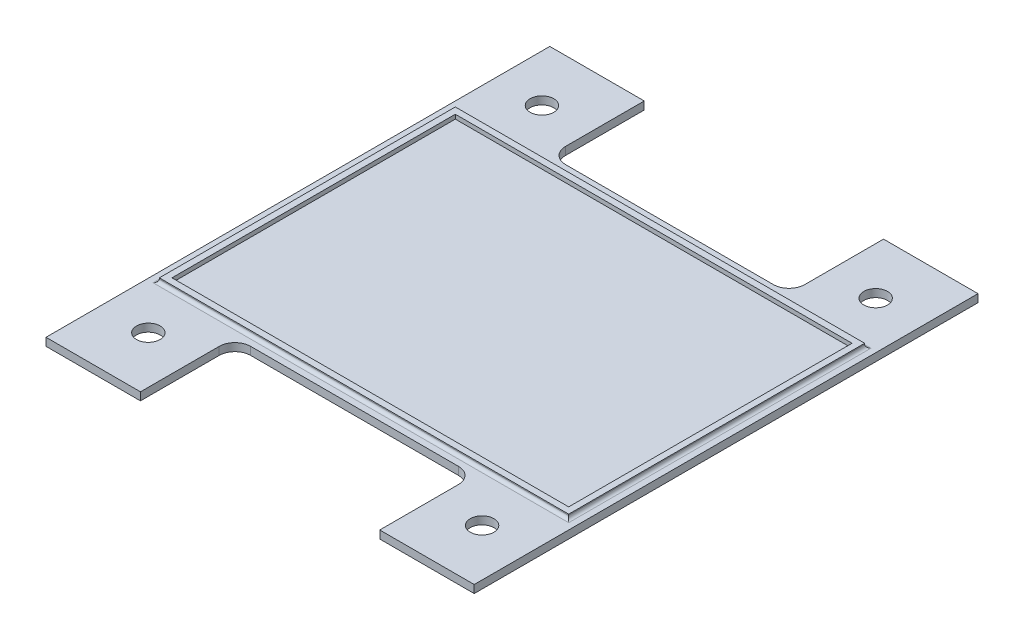
ISO-10303-21;
HEADER;
FILE_DESCRIPTION(('STEP AP214'),'2;1');
FILE_NAME('part.step','',(''),(''),'','','');
FILE_SCHEMA(('AUTOMOTIVE_DESIGN { 1 0 10303 214 1 1 1 1 }'));
ENDSEC;
DATA;
#1=APPLICATION_CONTEXT('core data for automotive mechanical design processes');
#2=APPLICATION_PROTOCOL_DEFINITION('international standard','automotive_design',2000,#1);
#3=PRODUCT_CONTEXT('',#1,'mechanical');
#4=PRODUCT('Part','Part','',(#3));
#5=PRODUCT_RELATED_PRODUCT_CATEGORY('part','',(#4));
#6=PRODUCT_DEFINITION_FORMATION('','',#4);
#7=PRODUCT_DEFINITION_CONTEXT('part definition',#1,'design');
#8=PRODUCT_DEFINITION('design','',#6,#7);
#9=PRODUCT_DEFINITION_SHAPE('','',#8);
#10=(LENGTH_UNIT() NAMED_UNIT(*) SI_UNIT(.MILLI.,.METRE.));
#11=(NAMED_UNIT(*) PLANE_ANGLE_UNIT() SI_UNIT($,.RADIAN.));
#12=(NAMED_UNIT(*) SI_UNIT($,.STERADIAN.) SOLID_ANGLE_UNIT());
#13=UNCERTAINTY_MEASURE_WITH_UNIT(LENGTH_MEASURE(1.E-05),#10,'distance_accuracy_value','');
#14=(GEOMETRIC_REPRESENTATION_CONTEXT(3) GLOBAL_UNCERTAINTY_ASSIGNED_CONTEXT((#13)) GLOBAL_UNIT_ASSIGNED_CONTEXT((#10,
#11,#12)) REPRESENTATION_CONTEXT('',''));
#15=CARTESIAN_POINT('',(0.,0.,0.));
#16=DIRECTION('',(0.,0.,1.));
#17=DIRECTION('',(1.,0.,0.));
#18=AXIS2_PLACEMENT_3D('',#15,#16,#17);
#19=CARTESIAN_POINT('',(0.,3.175,0.));
#20=DIRECTION('',(0.,-1.,0.));
#21=DIRECTION('',(0.,0.,-1.));
#22=AXIS2_PLACEMENT_3D('',#19,#20,#21);
#23=PLANE('',#22);
#24=DIRECTION('',(-1.,0.,0.));
#25=VECTOR('',#24,1.);
#26=CARTESIAN_POINT('',(82.55,3.175,-60.96));
#27=LINE('',#26,#25);
#28=CARTESIAN_POINT('',(-83.82,3.175,-60.96));
#29=VERTEX_POINT('',#28);
#30=CARTESIAN_POINT('',(83.82,3.175,-60.96));
#31=VERTEX_POINT('',#30);
#32=EDGE_CURVE('E390',#29,#31,#27,.F.);
#33=ORIENTED_EDGE('',*,*,#32,.T.);
#34=DIRECTION('',(0.,0.,-1.));
#35=VECTOR('',#34,1.);
#36=CARTESIAN_POINT('',(83.82,3.175,59.69));
#37=LINE('',#36,#35);
#38=CARTESIAN_POINT('',(83.82,3.175,60.96));
#39=VERTEX_POINT('',#38);
#40=EDGE_CURVE('E394',#31,#39,#37,.F.);
#41=ORIENTED_EDGE('',*,*,#40,.T.);
#42=DIRECTION('',(1.,0.,0.));
#43=VECTOR('',#42,1.);
#44=CARTESIAN_POINT('',(-82.55,3.175,60.96));
#45=LINE('',#44,#43);
#46=CARTESIAN_POINT('',(-83.82,3.175,60.96));
#47=VERTEX_POINT('',#46);
#48=EDGE_CURVE('E392',#39,#47,#45,.F.);
#49=ORIENTED_EDGE('',*,*,#48,.T.);
#50=DIRECTION('',(0.,0.,1.));
#51=VECTOR('',#50,1.);
#52=CARTESIAN_POINT('',(-83.82,3.175,-59.69));
#53=LINE('',#52,#51);
#54=EDGE_CURVE('E388',#47,#29,#53,.F.);
#55=ORIENTED_EDGE('',*,*,#54,.T.);
#56=EDGE_LOOP('',(#33,#41,#49,#55));
#57=FACE_BOUND('',#56,.T.);
#58=DIRECTION('',(1.,0.,0.));
#59=VECTOR('',#58,1.);
#60=CARTESIAN_POINT('',(-86.36,3.175,101.6));
#61=LINE('',#60,#59);
#62=CARTESIAN_POINT('',(-86.36,3.175,101.6));
#63=VERTEX_POINT('',#62);
#64=CARTESIAN_POINT('',(-48.26,3.175,101.6));
#65=VERTEX_POINT('',#64);
#66=EDGE_CURVE('E323',#63,#65,#61,.T.);
#67=ORIENTED_EDGE('',*,*,#66,.T.);
#68=DIRECTION('',(0.,0.,1.));
#69=VECTOR('',#68,1.);
#70=CARTESIAN_POINT('',(-48.26,3.175,101.6));
#71=LINE('',#70,#69);
#72=CARTESIAN_POINT('',(-48.26,3.175,69.85));
#73=VERTEX_POINT('',#72);
#74=EDGE_CURVE('E269',#73,#65,#71,.T.);
#75=ORIENTED_EDGE('',*,*,#74,.F.);
#76=CARTESIAN_POINT('',(-41.91,3.175,69.85));
#77=DIRECTION('',(0.,-1.,0.));
#78=DIRECTION('',(0.,0.,-1.));
#79=AXIS2_PLACEMENT_3D('',#76,#77,#78);
#80=CIRCLE('',#79,6.35);
#81=CARTESIAN_POINT('',(-41.91,3.175,63.5));
#82=VERTEX_POINT('',#81);
#83=EDGE_CURVE('E381',#73,#82,#80,.T.);
#84=ORIENTED_EDGE('',*,*,#83,.T.);
#85=DIRECTION('',(-1.,0.,0.));
#86=VECTOR('',#85,1.);
#87=CARTESIAN_POINT('',(-48.26,3.175,63.5));
#88=LINE('',#87,#86);
#89=CARTESIAN_POINT('',(41.91,3.175,63.5));
#90=VERTEX_POINT('',#89);
#91=EDGE_CURVE('E273',#90,#82,#88,.T.);
#92=ORIENTED_EDGE('',*,*,#91,.F.);
#93=CARTESIAN_POINT('',(41.91,3.175,69.85));
#94=DIRECTION('',(0.,-1.,0.));
#95=DIRECTION('',(0.,0.,-1.));
#96=AXIS2_PLACEMENT_3D('',#93,#94,#95);
#97=CIRCLE('',#96,6.35);
#98=CARTESIAN_POINT('',(48.26,3.175,69.85));
#99=VERTEX_POINT('',#98);
#100=EDGE_CURVE('E377',#90,#99,#97,.T.);
#101=ORIENTED_EDGE('',*,*,#100,.T.);
#102=DIRECTION('',(0.,0.,-1.));
#103=VECTOR('',#102,1.);
#104=CARTESIAN_POINT('',(48.26,3.175,101.6));
#105=LINE('',#104,#103);
#106=CARTESIAN_POINT('',(48.26,3.175,101.6));
#107=VERTEX_POINT('',#106);
#108=EDGE_CURVE('E281',#107,#99,#105,.T.);
#109=ORIENTED_EDGE('',*,*,#108,.F.);
#110=CARTESIAN_POINT('',(86.36,3.175,101.6));
#111=VERTEX_POINT('',#110);
#112=EDGE_CURVE('E322',#107,#111,#61,.T.);
#113=ORIENTED_EDGE('',*,*,#112,.T.);
#114=DIRECTION('',(0.,0.,-1.));
#115=VECTOR('',#114,1.);
#116=CARTESIAN_POINT('',(86.36,3.175,101.6));
#117=LINE('',#116,#115);
#118=CARTESIAN_POINT('',(86.36,3.175,-101.6));
#119=VERTEX_POINT('',#118);
#120=EDGE_CURVE('E312',#111,#119,#117,.T.);
#121=ORIENTED_EDGE('',*,*,#120,.T.);
#122=DIRECTION('',(-1.,0.,0.));
#123=VECTOR('',#122,1.);
#124=CARTESIAN_POINT('',(-86.36,3.175,-101.6));
#125=LINE('',#124,#123);
#126=CARTESIAN_POINT('',(48.26,3.175,-101.6));
#127=VERTEX_POINT('',#126);
#128=EDGE_CURVE('E317',#119,#127,#125,.T.);
#129=ORIENTED_EDGE('',*,*,#128,.T.);
#130=DIRECTION('',(0.,0.,-1.));
#131=VECTOR('',#130,1.);
#132=CARTESIAN_POINT('',(48.26,3.175,-101.6));
#133=LINE('',#132,#131);
#134=CARTESIAN_POINT('',(48.26,3.175,-69.85));
#135=VERTEX_POINT('',#134);
#136=EDGE_CURVE('E295',#135,#127,#133,.T.);
#137=ORIENTED_EDGE('',*,*,#136,.F.);
#138=CARTESIAN_POINT('',(41.91,3.175,-69.85));
#139=DIRECTION('',(0.,-1.,0.));
#140=DIRECTION('',(0.,0.,-1.));
#141=AXIS2_PLACEMENT_3D('',#138,#139,#140);
#142=CIRCLE('',#141,6.35);
#143=CARTESIAN_POINT('',(41.91,3.175,-63.5));
#144=VERTEX_POINT('',#143);
#145=EDGE_CURVE('E373',#135,#144,#142,.T.);
#146=ORIENTED_EDGE('',*,*,#145,.T.);
#147=DIRECTION('',(1.,0.,0.));
#148=VECTOR('',#147,1.);
#149=CARTESIAN_POINT('',(-48.26,3.175,-63.5));
#150=LINE('',#149,#148);
#151=CARTESIAN_POINT('',(-41.91,3.175,-63.5));
#152=VERTEX_POINT('',#151);
#153=EDGE_CURVE('E303',#152,#144,#150,.T.);
#154=ORIENTED_EDGE('',*,*,#153,.F.);
#155=CARTESIAN_POINT('',(-41.91,3.175,-69.85));
#156=DIRECTION('',(0.,-1.,0.));
#157=DIRECTION('',(0.,0.,-1.));
#158=AXIS2_PLACEMENT_3D('',#155,#156,#157);
#159=CIRCLE('',#158,6.35);
#160=CARTESIAN_POINT('',(-48.26,3.175,-69.85));
#161=VERTEX_POINT('',#160);
#162=EDGE_CURVE('E369',#152,#161,#159,.T.);
#163=ORIENTED_EDGE('',*,*,#162,.T.);
#164=DIRECTION('',(0.,0.,1.));
#165=VECTOR('',#164,1.);
#166=CARTESIAN_POINT('',(-48.26,3.175,-101.6));
#167=LINE('',#166,#165);
#168=CARTESIAN_POINT('',(-48.26,3.175,-101.6));
#169=VERTEX_POINT('',#168);
#170=EDGE_CURVE('E288',#169,#161,#167,.T.);
#171=ORIENTED_EDGE('',*,*,#170,.F.);
#172=CARTESIAN_POINT('',(-86.36,3.175,-101.6));
#173=VERTEX_POINT('',#172);
#174=EDGE_CURVE('E315',#169,#173,#125,.T.);
#175=ORIENTED_EDGE('',*,*,#174,.T.);
#176=DIRECTION('',(0.,0.,1.));
#177=VECTOR('',#176,1.);
#178=CARTESIAN_POINT('',(-86.36,3.175,101.6));
#179=LINE('',#178,#177);
#180=EDGE_CURVE('E320',#173,#63,#179,.T.);
#181=ORIENTED_EDGE('',*,*,#180,.T.);
#182=EDGE_LOOP('',(#67,#75,#84,#92,#101,#109,#113,#121,#129,#137,#146,#154,#163,#171,#175,#181));
#183=FACE_BOUND('',#182,.T.);
#184=CARTESIAN_POINT('',(-67.31,3.175,79.375));
#185=DIRECTION('',(0.,1.,0.));
#186=DIRECTION('',(0.,0.,1.));
#187=AXIS2_PLACEMENT_3D('',#184,#185,#186);
#188=CIRCLE('',#187,4.76249999999999);
#189=CARTESIAN_POINT('',(-67.31,3.175,84.1375));
#190=VERTEX_POINT('',#189);
#191=EDGE_CURVE('E810',#190,#190,#188,.T.);
#192=ORIENTED_EDGE('',*,*,#191,.F.);
#193=EDGE_LOOP('',(#192));
#194=FACE_BOUND('',#193,.T.);
#195=CARTESIAN_POINT('',(-67.31,3.175,-79.375));
#196=DIRECTION('',(0.,1.,0.));
#197=DIRECTION('',(0.,0.,1.));
#198=AXIS2_PLACEMENT_3D('',#195,#196,#197);
#199=CIRCLE('',#198,4.76249999999999);
#200=CARTESIAN_POINT('',(-67.31,3.175,-74.6125));
#201=VERTEX_POINT('',#200);
#202=EDGE_CURVE('E814',#201,#201,#199,.T.);
#203=ORIENTED_EDGE('',*,*,#202,.F.);
#204=EDGE_LOOP('',(#203));
#205=FACE_BOUND('',#204,.T.);
#206=CARTESIAN_POINT('',(67.31,3.175,-79.375));
#207=DIRECTION('',(0.,1.,0.));
#208=DIRECTION('',(0.,0.,1.));
#209=AXIS2_PLACEMENT_3D('',#206,#207,#208);
#210=CIRCLE('',#209,4.76249999999999);
#211=CARTESIAN_POINT('',(67.31,3.175,-74.6125));
#212=VERTEX_POINT('',#211);
#213=EDGE_CURVE('E818',#212,#212,#210,.T.);
#214=ORIENTED_EDGE('',*,*,#213,.F.);
#215=EDGE_LOOP('',(#214));
#216=FACE_BOUND('',#215,.T.);
#217=CARTESIAN_POINT('',(67.31,3.175,79.375));
#218=DIRECTION('',(0.,1.,0.));
#219=DIRECTION('',(0.,0.,1.));
#220=AXIS2_PLACEMENT_3D('',#217,#218,#219);
#221=CIRCLE('',#220,4.76249999999999);
#222=CARTESIAN_POINT('',(67.31,3.175,84.1375));
#223=VERTEX_POINT('',#222);
#224=EDGE_CURVE('E821',#223,#223,#221,.T.);
#225=ORIENTED_EDGE('',*,*,#224,.F.);
#226=EDGE_LOOP('',(#225));
#227=FACE_BOUND('',#226,.T.);
#228=ADVANCED_FACE('F33',(#57,#183,#194,#205,#216,#227),#23,.F.);
#229=CARTESIAN_POINT('',(-86.36,3.175,101.6));
#230=DIRECTION('',(0.,0.,-1.));
#231=DIRECTION('',(-1.,0.,0.));
#232=AXIS2_PLACEMENT_3D('',#229,#230,#231);
#233=PLANE('',#232);
#234=DIRECTION('',(1.,0.,0.));
#235=VECTOR('',#234,1.);
#236=CARTESIAN_POINT('',(-86.36,0.,101.6));
#237=LINE('',#236,#235);
#238=CARTESIAN_POINT('',(-86.36,0.,101.6));
#239=VERTEX_POINT('',#238);
#240=CARTESIAN_POINT('',(-48.26,0.,101.6));
#241=VERTEX_POINT('',#240);
#242=EDGE_CURVE('E316',#239,#241,#237,.T.);
#243=ORIENTED_EDGE('',*,*,#242,.T.);
#244=DIRECTION('',(0.,1.,0.));
#245=VECTOR('',#244,1.);
#246=CARTESIAN_POINT('',(-48.26,0.,101.6));
#247=LINE('',#246,#245);
#248=EDGE_CURVE('E279',#241,#65,#247,.T.);
#249=ORIENTED_EDGE('',*,*,#248,.T.);
#250=ORIENTED_EDGE('',*,*,#66,.F.);
#251=DIRECTION('',(0.,-1.,0.));
#252=VECTOR('',#251,1.);
#253=CARTESIAN_POINT('',(-86.36,3.175,101.6));
#254=LINE('',#253,#252);
#255=EDGE_CURVE('E340',#63,#239,#254,.T.);
#256=ORIENTED_EDGE('',*,*,#255,.T.);
#257=EDGE_LOOP('',(#243,#249,#250,#256));
#258=FACE_BOUND('',#257,.T.);
#259=ADVANCED_FACE('F447',(#258),#233,.F.);
#260=CARTESIAN_POINT('',(-86.36,3.175,-101.6));
#261=DIRECTION('',(0.,0.,1.));
#262=DIRECTION('',(1.,0.,0.));
#263=AXIS2_PLACEMENT_3D('',#260,#261,#262);
#264=PLANE('',#263);
#265=ORIENTED_EDGE('',*,*,#174,.F.);
#266=DIRECTION('',(0.,1.,0.));
#267=VECTOR('',#266,1.);
#268=CARTESIAN_POINT('',(-48.26,0.,-101.6));
#269=LINE('',#268,#267);
#270=CARTESIAN_POINT('',(-48.26,0.,-101.6));
#271=VERTEX_POINT('',#270);
#272=EDGE_CURVE('E307',#271,#169,#269,.T.);
#273=ORIENTED_EDGE('',*,*,#272,.F.);
#274=DIRECTION('',(-1.,0.,0.));
#275=VECTOR('',#274,1.);
#276=CARTESIAN_POINT('',(-86.36,0.,-101.6));
#277=LINE('',#276,#275);
#278=CARTESIAN_POINT('',(-86.36,0.,-101.6));
#279=VERTEX_POINT('',#278);
#280=EDGE_CURVE('E329',#271,#279,#277,.T.);
#281=ORIENTED_EDGE('',*,*,#280,.T.);
#282=DIRECTION('',(0.,-1.,0.));
#283=VECTOR('',#282,1.);
#284=CARTESIAN_POINT('',(-86.36,3.175,-101.6));
#285=LINE('',#284,#283);
#286=EDGE_CURVE('E343',#173,#279,#285,.T.);
#287=ORIENTED_EDGE('',*,*,#286,.F.);
#288=EDGE_LOOP('',(#265,#273,#281,#287));
#289=FACE_BOUND('',#288,.T.);
#290=ADVANCED_FACE('F453',(#289),#264,.F.);
#291=CARTESIAN_POINT('',(86.36,3.175,101.6));
#292=DIRECTION('',(-1.,0.,0.));
#293=DIRECTION('',(0.,0.,1.));
#294=AXIS2_PLACEMENT_3D('',#291,#292,#293);
#295=PLANE('',#294);
#296=DIRECTION('',(0.,0.,-1.));
#297=VECTOR('',#296,1.);
#298=CARTESIAN_POINT('',(86.36,0.,101.6));
#299=LINE('',#298,#297);
#300=CARTESIAN_POINT('',(86.36,0.,101.6));
#301=VERTEX_POINT('',#300);
#302=CARTESIAN_POINT('',(86.36,0.,-101.6));
#303=VERTEX_POINT('',#302);
#304=EDGE_CURVE('E309',#301,#303,#299,.T.);
#305=ORIENTED_EDGE('',*,*,#304,.T.);
#306=DIRECTION('',(0.,-1.,0.));
#307=VECTOR('',#306,1.);
#308=CARTESIAN_POINT('',(86.36,3.175,-101.6));
#309=LINE('',#308,#307);
#310=EDGE_CURVE('E346',#119,#303,#309,.T.);
#311=ORIENTED_EDGE('',*,*,#310,.F.);
#312=ORIENTED_EDGE('',*,*,#120,.F.);
#313=DIRECTION('',(0.,-1.,0.));
#314=VECTOR('',#313,1.);
#315=CARTESIAN_POINT('',(86.36,3.175,101.6));
#316=LINE('',#315,#314);
#317=EDGE_CURVE('E326',#111,#301,#316,.T.);
#318=ORIENTED_EDGE('',*,*,#317,.T.);
#319=EDGE_LOOP('',(#305,#311,#312,#318));
#320=FACE_BOUND('',#319,.T.);
#321=ADVANCED_FACE('F707',(#320),#295,.F.);
#322=CARTESIAN_POINT('',(48.26,0.,-101.6));
#323=VERTEX_POINT('',#322);
#324=EDGE_CURVE('E330',#303,#323,#277,.T.);
#325=ORIENTED_EDGE('',*,*,#324,.T.);
#326=DIRECTION('',(0.,1.,0.));
#327=VECTOR('',#326,1.);
#328=CARTESIAN_POINT('',(48.26,0.,-101.6));
#329=LINE('',#328,#327);
#330=EDGE_CURVE('E300',#323,#127,#329,.T.);
#331=ORIENTED_EDGE('',*,*,#330,.T.);
#332=ORIENTED_EDGE('',*,*,#128,.F.);
#333=ORIENTED_EDGE('',*,*,#310,.T.);
#334=EDGE_LOOP('',(#325,#331,#332,#333));
#335=FACE_BOUND('',#334,.T.);
#336=ADVANCED_FACE('F710',(#335),#264,.F.);
#337=CARTESIAN_POINT('',(-86.36,3.175,101.6));
#338=DIRECTION('',(1.,0.,0.));
#339=DIRECTION('',(0.,0.,-1.));
#340=AXIS2_PLACEMENT_3D('',#337,#338,#339);
#341=PLANE('',#340);
#342=DIRECTION('',(0.,0.,1.));
#343=VECTOR('',#342,1.);
#344=CARTESIAN_POINT('',(-86.36,0.,101.6));
#345=LINE('',#344,#343);
#346=EDGE_CURVE('E333',#279,#239,#345,.T.);
#347=ORIENTED_EDGE('',*,*,#346,.T.);
#348=ORIENTED_EDGE('',*,*,#255,.F.);
#349=ORIENTED_EDGE('',*,*,#180,.F.);
#350=ORIENTED_EDGE('',*,*,#286,.T.);
#351=EDGE_LOOP('',(#347,#348,#349,#350));
#352=FACE_BOUND('',#351,.T.);
#353=ADVANCED_FACE('F727',(#352),#341,.F.);
#354=ORIENTED_EDGE('',*,*,#112,.F.);
#355=DIRECTION('',(0.,1.,0.));
#356=VECTOR('',#355,1.);
#357=CARTESIAN_POINT('',(48.26,0.,101.6));
#358=LINE('',#357,#356);
#359=CARTESIAN_POINT('',(48.26,0.,101.6));
#360=VERTEX_POINT('',#359);
#361=EDGE_CURVE('E286',#360,#107,#358,.T.);
#362=ORIENTED_EDGE('',*,*,#361,.F.);
#363=EDGE_CURVE('E335',#360,#301,#237,.T.);
#364=ORIENTED_EDGE('',*,*,#363,.T.);
#365=ORIENTED_EDGE('',*,*,#317,.F.);
#366=EDGE_LOOP('',(#354,#362,#364,#365));
#367=FACE_BOUND('',#366,.T.);
#368=ADVANCED_FACE('F456',(#367),#233,.F.);
#369=CARTESIAN_POINT('',(0.,0.,0.));
#370=DIRECTION('',(0.,-1.,0.));
#371=DIRECTION('',(0.,0.,-1.));
#372=AXIS2_PLACEMENT_3D('',#369,#370,#371);
#373=PLANE('',#372);
#374=CARTESIAN_POINT('',(67.31,0.,79.375));
#375=DIRECTION('',(0.,-1.,0.));
#376=DIRECTION('',(0.,0.,-1.));
#377=AXIS2_PLACEMENT_3D('',#374,#375,#376);
#378=CIRCLE('',#377,4.7625);
#379=CARTESIAN_POINT('',(67.31,0.,74.6125));
#380=VERTEX_POINT('',#379);
#381=EDGE_CURVE('E822',#380,#380,#378,.T.);
#382=ORIENTED_EDGE('',*,*,#381,.F.);
#383=EDGE_LOOP('',(#382));
#384=FACE_BOUND('',#383,.T.);
#385=CARTESIAN_POINT('',(67.31,0.,-79.375));
#386=DIRECTION('',(0.,-1.,0.));
#387=DIRECTION('',(0.,0.,-1.));
#388=AXIS2_PLACEMENT_3D('',#385,#386,#387);
#389=CIRCLE('',#388,4.7625);
#390=CARTESIAN_POINT('',(67.31,0.,-84.1375));
#391=VERTEX_POINT('',#390);
#392=EDGE_CURVE('E828',#391,#391,#389,.T.);
#393=ORIENTED_EDGE('',*,*,#392,.F.);
#394=EDGE_LOOP('',(#393));
#395=FACE_BOUND('',#394,.T.);
#396=CARTESIAN_POINT('',(-67.31,0.,-79.375));
#397=DIRECTION('',(0.,-1.,0.));
#398=DIRECTION('',(0.,0.,-1.));
#399=AXIS2_PLACEMENT_3D('',#396,#397,#398);
#400=CIRCLE('',#399,4.7625);
#401=CARTESIAN_POINT('',(-67.31,0.,-84.1375));
#402=VERTEX_POINT('',#401);
#403=EDGE_CURVE('E832',#402,#402,#400,.T.);
#404=ORIENTED_EDGE('',*,*,#403,.F.);
#405=EDGE_LOOP('',(#404));
#406=FACE_BOUND('',#405,.T.);
#407=CARTESIAN_POINT('',(-67.31,0.,79.375));
#408=DIRECTION('',(0.,-1.,0.));
#409=DIRECTION('',(0.,0.,-1.));
#410=AXIS2_PLACEMENT_3D('',#407,#408,#409);
#411=CIRCLE('',#410,4.7625);
#412=CARTESIAN_POINT('',(-67.31,0.,74.6125));
#413=VERTEX_POINT('',#412);
#414=EDGE_CURVE('E403',#413,#413,#411,.T.);
#415=ORIENTED_EDGE('',*,*,#414,.F.);
#416=EDGE_LOOP('',(#415));
#417=FACE_BOUND('',#416,.T.);
#418=DIRECTION('',(-1.,0.,0.));
#419=VECTOR('',#418,1.);
#420=CARTESIAN_POINT('',(-48.26,0.,63.5));
#421=LINE('',#420,#419);
#422=CARTESIAN_POINT('',(41.91,0.,63.5));
#423=VERTEX_POINT('',#422);
#424=CARTESIAN_POINT('',(-41.91,0.,63.5));
#425=VERTEX_POINT('',#424);
#426=EDGE_CURVE('E276',#423,#425,#421,.T.);
#427=ORIENTED_EDGE('',*,*,#426,.T.);
#428=CARTESIAN_POINT('',(-41.91,0.,69.85));
#429=DIRECTION('',(0.,-1.,0.));
#430=DIRECTION('',(0.,0.,-1.));
#431=AXIS2_PLACEMENT_3D('',#428,#429,#430);
#432=CIRCLE('',#431,6.35);
#433=CARTESIAN_POINT('',(-48.26,0.,69.85));
#434=VERTEX_POINT('',#433);
#435=EDGE_CURVE('E383',#425,#434,#432,.F.);
#436=ORIENTED_EDGE('',*,*,#435,.T.);
#437=DIRECTION('',(0.,0.,1.));
#438=VECTOR('',#437,1.);
#439=CARTESIAN_POINT('',(-48.26,0.,101.6));
#440=LINE('',#439,#438);
#441=EDGE_CURVE('E270',#434,#241,#440,.T.);
#442=ORIENTED_EDGE('',*,*,#441,.T.);
#443=ORIENTED_EDGE('',*,*,#242,.F.);
#444=ORIENTED_EDGE('',*,*,#346,.F.);
#445=ORIENTED_EDGE('',*,*,#280,.F.);
#446=DIRECTION('',(0.,0.,1.));
#447=VECTOR('',#446,1.);
#448=CARTESIAN_POINT('',(-48.26,0.,-101.6));
#449=LINE('',#448,#447);
#450=CARTESIAN_POINT('',(-48.26,0.,-69.85));
#451=VERTEX_POINT('',#450);
#452=EDGE_CURVE('E291',#271,#451,#449,.T.);
#453=ORIENTED_EDGE('',*,*,#452,.T.);
#454=CARTESIAN_POINT('',(-41.91,0.,-69.85));
#455=DIRECTION('',(0.,-1.,0.));
#456=DIRECTION('',(0.,0.,-1.));
#457=AXIS2_PLACEMENT_3D('',#454,#455,#456);
#458=CIRCLE('',#457,6.35);
#459=CARTESIAN_POINT('',(-41.91,0.,-63.5));
#460=VERTEX_POINT('',#459);
#461=EDGE_CURVE('E371',#451,#460,#458,.F.);
#462=ORIENTED_EDGE('',*,*,#461,.T.);
#463=DIRECTION('',(1.,0.,0.));
#464=VECTOR('',#463,1.);
#465=CARTESIAN_POINT('',(-48.26,0.,-63.5));
#466=LINE('',#465,#464);
#467=CARTESIAN_POINT('',(41.91,0.,-63.5));
#468=VERTEX_POINT('',#467);
#469=EDGE_CURVE('E294',#460,#468,#466,.T.);
#470=ORIENTED_EDGE('',*,*,#469,.T.);
#471=CARTESIAN_POINT('',(41.91,0.,-69.85));
#472=DIRECTION('',(0.,-1.,0.));
#473=DIRECTION('',(0.,0.,-1.));
#474=AXIS2_PLACEMENT_3D('',#471,#472,#473);
#475=CIRCLE('',#474,6.35);
#476=CARTESIAN_POINT('',(48.26,0.,-69.85));
#477=VERTEX_POINT('',#476);
#478=EDGE_CURVE('E375',#468,#477,#475,.F.);
#479=ORIENTED_EDGE('',*,*,#478,.T.);
#480=DIRECTION('',(0.,0.,-1.));
#481=VECTOR('',#480,1.);
#482=CARTESIAN_POINT('',(48.26,0.,-101.6));
#483=LINE('',#482,#481);
#484=EDGE_CURVE('E298',#477,#323,#483,.T.);
#485=ORIENTED_EDGE('',*,*,#484,.T.);
#486=ORIENTED_EDGE('',*,*,#324,.F.);
#487=ORIENTED_EDGE('',*,*,#304,.F.);
#488=ORIENTED_EDGE('',*,*,#363,.F.);
#489=DIRECTION('',(0.,0.,-1.));
#490=VECTOR('',#489,1.);
#491=CARTESIAN_POINT('',(48.26,0.,101.6));
#492=LINE('',#491,#490);
#493=CARTESIAN_POINT('',(48.26,0.,69.85));
#494=VERTEX_POINT('',#493);
#495=EDGE_CURVE('E272',#360,#494,#492,.T.);
#496=ORIENTED_EDGE('',*,*,#495,.T.);
#497=CARTESIAN_POINT('',(41.91,0.,69.85));
#498=DIRECTION('',(0.,-1.,0.));
#499=DIRECTION('',(0.,0.,-1.));
#500=AXIS2_PLACEMENT_3D('',#497,#498,#499);
#501=CIRCLE('',#500,6.35);
#502=EDGE_CURVE('E379',#494,#423,#501,.F.);
#503=ORIENTED_EDGE('',*,*,#502,.T.);
#504=EDGE_LOOP('',(#427,#436,#442,#443,#444,#445,#453,#462,#470,#479,#485,#486,#487,#488,#496,#503));
#505=FACE_BOUND('',#504,.T.);
#506=ADVANCED_FACE('F692',(#384,#395,#406,#417,#505),#373,.T.);
#507=CARTESIAN_POINT('',(-48.26,0.,-101.6));
#508=DIRECTION('',(-1.,0.,0.));
#509=DIRECTION('',(0.,0.,1.));
#510=AXIS2_PLACEMENT_3D('',#507,#508,#509);
#511=PLANE('',#510);
#512=ORIENTED_EDGE('',*,*,#170,.T.);
#513=DIRECTION('',(0.,1.,0.));
#514=VECTOR('',#513,1.);
#515=CARTESIAN_POINT('',(-48.26,0.,-69.85));
#516=LINE('',#515,#514);
#517=EDGE_CURVE('E354',#161,#451,#516,.F.);
#518=ORIENTED_EDGE('',*,*,#517,.T.);
#519=ORIENTED_EDGE('',*,*,#452,.F.);
#520=ORIENTED_EDGE('',*,*,#272,.T.);
#521=EDGE_LOOP('',(#512,#518,#519,#520));
#522=FACE_BOUND('',#521,.T.);
#523=ADVANCED_FACE('F683',(#522),#511,.F.);
#524=CARTESIAN_POINT('',(48.26,0.,-101.6));
#525=DIRECTION('',(1.,0.,0.));
#526=DIRECTION('',(0.,0.,-1.));
#527=AXIS2_PLACEMENT_3D('',#524,#525,#526);
#528=PLANE('',#527);
#529=ORIENTED_EDGE('',*,*,#484,.F.);
#530=DIRECTION('',(0.,1.,0.));
#531=VECTOR('',#530,1.);
#532=CARTESIAN_POINT('',(48.26,3.175,-69.85));
#533=LINE('',#532,#531);
#534=EDGE_CURVE('E356',#477,#135,#533,.T.);
#535=ORIENTED_EDGE('',*,*,#534,.T.);
#536=ORIENTED_EDGE('',*,*,#136,.T.);
#537=ORIENTED_EDGE('',*,*,#330,.F.);
#538=EDGE_LOOP('',(#529,#535,#536,#537));
#539=FACE_BOUND('',#538,.T.);
#540=ADVANCED_FACE('F674',(#539),#528,.F.);
#541=CARTESIAN_POINT('',(-48.26,0.,-63.5));
#542=DIRECTION('',(0.,0.,1.));
#543=DIRECTION('',(1.,0.,0.));
#544=AXIS2_PLACEMENT_3D('',#541,#542,#543);
#545=PLANE('',#544);
#546=ORIENTED_EDGE('',*,*,#469,.F.);
#547=DIRECTION('',(0.,1.,0.));
#548=VECTOR('',#547,1.);
#549=CARTESIAN_POINT('',(-41.91,3.175,-63.5));
#550=LINE('',#549,#548);
#551=EDGE_CURVE('E351',#460,#152,#550,.T.);
#552=ORIENTED_EDGE('',*,*,#551,.T.);
#553=ORIENTED_EDGE('',*,*,#153,.T.);
#554=DIRECTION('',(0.,1.,0.));
#555=VECTOR('',#554,1.);
#556=CARTESIAN_POINT('',(41.91,0.,-63.5));
#557=LINE('',#556,#555);
#558=EDGE_CURVE('E349',#144,#468,#557,.F.);
#559=ORIENTED_EDGE('',*,*,#558,.T.);
#560=EDGE_LOOP('',(#546,#552,#553,#559));
#561=FACE_BOUND('',#560,.T.);
#562=ADVANCED_FACE('F665',(#561),#545,.F.);
#563=CARTESIAN_POINT('',(-48.26,0.,101.6));
#564=DIRECTION('',(-1.,0.,0.));
#565=DIRECTION('',(0.,0.,1.));
#566=AXIS2_PLACEMENT_3D('',#563,#564,#565);
#567=PLANE('',#566);
#568=ORIENTED_EDGE('',*,*,#441,.F.);
#569=DIRECTION('',(0.,1.,0.));
#570=VECTOR('',#569,1.);
#571=CARTESIAN_POINT('',(-48.26,3.175,69.85));
#572=LINE('',#571,#570);
#573=EDGE_CURVE('E366',#434,#73,#572,.T.);
#574=ORIENTED_EDGE('',*,*,#573,.T.);
#575=ORIENTED_EDGE('',*,*,#74,.T.);
#576=ORIENTED_EDGE('',*,*,#248,.F.);
#577=EDGE_LOOP('',(#568,#574,#575,#576));
#578=FACE_BOUND('',#577,.T.);
#579=ADVANCED_FACE('F656',(#578),#567,.F.);
#580=CARTESIAN_POINT('',(-48.26,0.,63.5));
#581=DIRECTION('',(0.,0.,-1.));
#582=DIRECTION('',(-1.,0.,0.));
#583=AXIS2_PLACEMENT_3D('',#580,#581,#582);
#584=PLANE('',#583);
#585=ORIENTED_EDGE('',*,*,#426,.F.);
#586=DIRECTION('',(0.,1.,0.));
#587=VECTOR('',#586,1.);
#588=CARTESIAN_POINT('',(41.91,3.175,63.5));
#589=LINE('',#588,#587);
#590=EDGE_CURVE('E361',#423,#90,#589,.T.);
#591=ORIENTED_EDGE('',*,*,#590,.T.);
#592=ORIENTED_EDGE('',*,*,#91,.T.);
#593=DIRECTION('',(0.,1.,0.));
#594=VECTOR('',#593,1.);
#595=CARTESIAN_POINT('',(-41.91,0.,63.5));
#596=LINE('',#595,#594);
#597=EDGE_CURVE('E359',#82,#425,#596,.F.);
#598=ORIENTED_EDGE('',*,*,#597,.T.);
#599=EDGE_LOOP('',(#585,#591,#592,#598));
#600=FACE_BOUND('',#599,.T.);
#601=ADVANCED_FACE('F647',(#600),#584,.F.);
#602=CARTESIAN_POINT('',(48.26,0.,101.6));
#603=DIRECTION('',(1.,0.,0.));
#604=DIRECTION('',(0.,0.,-1.));
#605=AXIS2_PLACEMENT_3D('',#602,#603,#604);
#606=PLANE('',#605);
#607=ORIENTED_EDGE('',*,*,#108,.T.);
#608=DIRECTION('',(0.,1.,0.));
#609=VECTOR('',#608,1.);
#610=CARTESIAN_POINT('',(48.26,0.,69.85));
#611=LINE('',#610,#609);
#612=EDGE_CURVE('E364',#99,#494,#611,.F.);
#613=ORIENTED_EDGE('',*,*,#612,.T.);
#614=ORIENTED_EDGE('',*,*,#495,.F.);
#615=ORIENTED_EDGE('',*,*,#361,.T.);
#616=EDGE_LOOP('',(#607,#613,#614,#615));
#617=FACE_BOUND('',#616,.T.);
#618=ADVANCED_FACE('F638',(#617),#606,.F.);
#619=CARTESIAN_POINT('',(-41.91,0.,-69.85));
#620=DIRECTION('',(0.,-1.,0.));
#621=DIRECTION('',(0.,0.,-1.));
#622=AXIS2_PLACEMENT_3D('',#619,#620,#621);
#623=CYLINDRICAL_SURFACE('',#622,6.35);
#624=ORIENTED_EDGE('',*,*,#461,.F.);
#625=ORIENTED_EDGE('',*,*,#517,.F.);
#626=ORIENTED_EDGE('',*,*,#162,.F.);
#627=ORIENTED_EDGE('',*,*,#551,.F.);
#628=EDGE_LOOP('',(#624,#625,#626,#627));
#629=FACE_BOUND('',#628,.T.);
#630=ADVANCED_FACE('F630',(#629),#623,.F.);
#631=CARTESIAN_POINT('',(41.91,0.,-69.85));
#632=DIRECTION('',(0.,-1.,0.));
#633=DIRECTION('',(0.,0.,-1.));
#634=AXIS2_PLACEMENT_3D('',#631,#632,#633);
#635=CYLINDRICAL_SURFACE('',#634,6.35);
#636=ORIENTED_EDGE('',*,*,#478,.F.);
#637=ORIENTED_EDGE('',*,*,#558,.F.);
#638=ORIENTED_EDGE('',*,*,#145,.F.);
#639=ORIENTED_EDGE('',*,*,#534,.F.);
#640=EDGE_LOOP('',(#636,#637,#638,#639));
#641=FACE_BOUND('',#640,.T.);
#642=ADVANCED_FACE('F495',(#641),#635,.F.);
#643=CARTESIAN_POINT('',(41.91,0.,69.85));
#644=DIRECTION('',(0.,-1.,0.));
#645=DIRECTION('',(0.,0.,-1.));
#646=AXIS2_PLACEMENT_3D('',#643,#644,#645);
#647=CYLINDRICAL_SURFACE('',#646,6.35);
#648=ORIENTED_EDGE('',*,*,#502,.F.);
#649=ORIENTED_EDGE('',*,*,#612,.F.);
#650=ORIENTED_EDGE('',*,*,#100,.F.);
#651=ORIENTED_EDGE('',*,*,#590,.F.);
#652=EDGE_LOOP('',(#648,#649,#650,#651));
#653=FACE_BOUND('',#652,.T.);
#654=ADVANCED_FACE('F489',(#653),#647,.F.);
#655=CARTESIAN_POINT('',(-41.91,0.,69.85));
#656=DIRECTION('',(0.,-1.,0.));
#657=DIRECTION('',(0.,0.,-1.));
#658=AXIS2_PLACEMENT_3D('',#655,#656,#657);
#659=CYLINDRICAL_SURFACE('',#658,6.35);
#660=ORIENTED_EDGE('',*,*,#435,.F.);
#661=ORIENTED_EDGE('',*,*,#597,.F.);
#662=ORIENTED_EDGE('',*,*,#83,.F.);
#663=ORIENTED_EDGE('',*,*,#573,.F.);
#664=EDGE_LOOP('',(#660,#661,#662,#663));
#665=FACE_BOUND('',#664,.T.);
#666=ADVANCED_FACE('F483',(#665),#659,.F.);
#667=CARTESIAN_POINT('',(0.,4.8895,0.));
#668=DIRECTION('',(0.,-1.,0.));
#669=DIRECTION('',(0.,0.,-1.));
#670=AXIS2_PLACEMENT_3D('',#667,#668,#669);
#671=PLANE('',#670);
#672=DIRECTION('',(0.,0.,-1.));
#673=VECTOR('',#672,1.);
#674=CARTESIAN_POINT('',(82.55,4.8895,59.69));
#675=LINE('',#674,#673);
#676=CARTESIAN_POINT('',(82.55,4.8895,59.69));
#677=VERTEX_POINT('',#676);
#678=CARTESIAN_POINT('',(82.55,4.8895,-59.69));
#679=VERTEX_POINT('',#678);
#680=EDGE_CURVE('E227',#677,#679,#675,.T.);
#681=ORIENTED_EDGE('',*,*,#680,.T.);
#682=DIRECTION('',(-1.,0.,0.));
#683=VECTOR('',#682,1.);
#684=CARTESIAN_POINT('',(-82.55,4.8895,-59.69));
#685=LINE('',#684,#683);
#686=CARTESIAN_POINT('',(-82.55,4.8895,-59.69));
#687=VERTEX_POINT('',#686);
#688=EDGE_CURVE('E254',#679,#687,#685,.T.);
#689=ORIENTED_EDGE('',*,*,#688,.T.);
#690=DIRECTION('',(0.,0.,1.));
#691=VECTOR('',#690,1.);
#692=CARTESIAN_POINT('',(-82.55,4.8895,59.69));
#693=LINE('',#692,#691);
#694=CARTESIAN_POINT('',(-82.55,4.8895,59.69));
#695=VERTEX_POINT('',#694);
#696=EDGE_CURVE('E256',#687,#695,#693,.T.);
#697=ORIENTED_EDGE('',*,*,#696,.T.);
#698=DIRECTION('',(1.,0.,0.));
#699=VECTOR('',#698,1.);
#700=CARTESIAN_POINT('',(-82.55,4.8895,59.69));
#701=LINE('',#700,#699);
#702=EDGE_CURVE('E258',#695,#677,#701,.T.);
#703=ORIENTED_EDGE('',*,*,#702,.T.);
#704=EDGE_LOOP('',(#681,#689,#697,#703));
#705=FACE_BOUND('',#704,.T.);
#706=DIRECTION('',(1.,0.,0.));
#707=VECTOR('',#706,1.);
#708=CARTESIAN_POINT('',(-80.01,4.8895,57.15));
#709=LINE('',#708,#707);
#710=CARTESIAN_POINT('',(-80.01,4.8895,57.15));
#711=VERTEX_POINT('',#710);
#712=CARTESIAN_POINT('',(80.01,4.8895,57.15));
#713=VERTEX_POINT('',#712);
#714=EDGE_CURVE('E209',#711,#713,#709,.T.);
#715=ORIENTED_EDGE('',*,*,#714,.F.);
#716=DIRECTION('',(0.,0.,1.));
#717=VECTOR('',#716,1.);
#718=CARTESIAN_POINT('',(-80.01,4.8895,57.15));
#719=LINE('',#718,#717);
#720=CARTESIAN_POINT('',(-80.01,4.8895,-57.15));
#721=VERTEX_POINT('',#720);
#722=EDGE_CURVE('E235',#721,#711,#719,.T.);
#723=ORIENTED_EDGE('',*,*,#722,.F.);
#724=DIRECTION('',(-1.,0.,0.));
#725=VECTOR('',#724,1.);
#726=CARTESIAN_POINT('',(-80.01,4.8895,-57.15));
#727=LINE('',#726,#725);
#728=CARTESIAN_POINT('',(80.01,4.8895,-57.15));
#729=VERTEX_POINT('',#728);
#730=EDGE_CURVE('E233',#729,#721,#727,.T.);
#731=ORIENTED_EDGE('',*,*,#730,.F.);
#732=DIRECTION('',(0.,0.,-1.));
#733=VECTOR('',#732,1.);
#734=CARTESIAN_POINT('',(80.01,4.8895,57.15));
#735=LINE('',#734,#733);
#736=EDGE_CURVE('E219',#713,#729,#735,.T.);
#737=ORIENTED_EDGE('',*,*,#736,.F.);
#738=EDGE_LOOP('',(#715,#723,#731,#737));
#739=FACE_BOUND('',#738,.T.);
#740=ADVANCED_FACE('F231',(#705,#739),#671,.F.);
#741=CARTESIAN_POINT('',(82.55,4.8895,59.69));
#742=DIRECTION('',(-1.,0.,0.));
#743=DIRECTION('',(0.,0.,1.));
#744=AXIS2_PLACEMENT_3D('',#741,#742,#743);
#745=PLANE('',#744);
#746=DIRECTION('',(0.,-1.,0.));
#747=VECTOR('',#746,1.);
#748=CARTESIAN_POINT('',(82.55,4.8895,59.69));
#749=LINE('',#748,#747);
#750=CARTESIAN_POINT('',(82.55,4.445,59.69));
#751=VERTEX_POINT('',#750);
#752=EDGE_CURVE('E260',#677,#751,#749,.T.);
#753=ORIENTED_EDGE('',*,*,#752,.T.);
#754=DIRECTION('',(0.,0.,-1.));
#755=VECTOR('',#754,1.);
#756=CARTESIAN_POINT('',(82.55,4.445,-59.69));
#757=LINE('',#756,#755);
#758=CARTESIAN_POINT('',(82.55,4.445,-59.69));
#759=VERTEX_POINT('',#758);
#760=EDGE_CURVE('E385',#751,#759,#757,.T.);
#761=ORIENTED_EDGE('',*,*,#760,.T.);
#762=DIRECTION('',(0.,-1.,0.));
#763=VECTOR('',#762,1.);
#764=CARTESIAN_POINT('',(82.55,4.8895,-59.69));
#765=LINE('',#764,#763);
#766=EDGE_CURVE('E267',#679,#759,#765,.T.);
#767=ORIENTED_EDGE('',*,*,#766,.F.);
#768=ORIENTED_EDGE('',*,*,#680,.F.);
#769=EDGE_LOOP('',(#753,#761,#767,#768));
#770=FACE_BOUND('',#769,.T.);
#771=ADVANCED_FACE('F428',(#770),#745,.F.);
#772=CARTESIAN_POINT('',(-82.55,4.8895,-59.69));
#773=DIRECTION('',(0.,0.,1.));
#774=DIRECTION('',(1.,0.,0.));
#775=AXIS2_PLACEMENT_3D('',#772,#773,#774);
#776=PLANE('',#775);
#777=ORIENTED_EDGE('',*,*,#766,.T.);
#778=DIRECTION('',(-1.,0.,0.));
#779=VECTOR('',#778,1.);
#780=CARTESIAN_POINT('',(-82.55,4.445,-59.69));
#781=LINE('',#780,#779);
#782=CARTESIAN_POINT('',(-82.55,4.445,-59.69));
#783=VERTEX_POINT('',#782);
#784=EDGE_CURVE('E42',#759,#783,#781,.T.);
#785=ORIENTED_EDGE('',*,*,#784,.T.);
#786=DIRECTION('',(0.,-1.,0.));
#787=VECTOR('',#786,1.);
#788=CARTESIAN_POINT('',(-82.55,4.8895,-59.69));
#789=LINE('',#788,#787);
#790=EDGE_CURVE('E265',#687,#783,#789,.T.);
#791=ORIENTED_EDGE('',*,*,#790,.F.);
#792=ORIENTED_EDGE('',*,*,#688,.F.);
#793=EDGE_LOOP('',(#777,#785,#791,#792));
#794=FACE_BOUND('',#793,.T.);
#795=ADVANCED_FACE('F431',(#794),#776,.F.);
#796=CARTESIAN_POINT('',(-82.55,4.8895,59.69));
#797=DIRECTION('',(1.,0.,0.));
#798=DIRECTION('',(0.,0.,-1.));
#799=AXIS2_PLACEMENT_3D('',#796,#797,#798);
#800=PLANE('',#799);
#801=ORIENTED_EDGE('',*,*,#790,.T.);
#802=DIRECTION('',(0.,0.,1.));
#803=VECTOR('',#802,1.);
#804=CARTESIAN_POINT('',(-82.55,4.445,59.69));
#805=LINE('',#804,#803);
#806=CARTESIAN_POINT('',(-82.55,4.445,59.69));
#807=VERTEX_POINT('',#806);
#808=EDGE_CURVE('E11',#783,#807,#805,.T.);
#809=ORIENTED_EDGE('',*,*,#808,.T.);
#810=DIRECTION('',(0.,-1.,0.));
#811=VECTOR('',#810,1.);
#812=CARTESIAN_POINT('',(-82.55,4.8895,59.69));
#813=LINE('',#812,#811);
#814=EDGE_CURVE('E263',#695,#807,#813,.T.);
#815=ORIENTED_EDGE('',*,*,#814,.F.);
#816=ORIENTED_EDGE('',*,*,#696,.F.);
#817=EDGE_LOOP('',(#801,#809,#815,#816));
#818=FACE_BOUND('',#817,.T.);
#819=ADVANCED_FACE('F437',(#818),#800,.F.);
#820=CARTESIAN_POINT('',(-82.55,4.8895,59.69));
#821=DIRECTION('',(0.,0.,-1.));
#822=DIRECTION('',(-1.,0.,0.));
#823=AXIS2_PLACEMENT_3D('',#820,#821,#822);
#824=PLANE('',#823);
#825=ORIENTED_EDGE('',*,*,#814,.T.);
#826=DIRECTION('',(1.,0.,0.));
#827=VECTOR('',#826,1.);
#828=CARTESIAN_POINT('',(82.55,4.445,59.69));
#829=LINE('',#828,#827);
#830=EDGE_CURVE('E397',#807,#751,#829,.T.);
#831=ORIENTED_EDGE('',*,*,#830,.T.);
#832=ORIENTED_EDGE('',*,*,#752,.F.);
#833=ORIENTED_EDGE('',*,*,#702,.F.);
#834=EDGE_LOOP('',(#825,#831,#832,#833));
#835=FACE_BOUND('',#834,.T.);
#836=ADVANCED_FACE('F436',(#835),#824,.F.);
#837=CARTESIAN_POINT('',(-80.01,4.8895,57.15));
#838=DIRECTION('',(0.,0.,-1.));
#839=DIRECTION('',(-1.,0.,0.));
#840=AXIS2_PLACEMENT_3D('',#837,#838,#839);
#841=PLANE('',#840);
#842=DIRECTION('',(1.,0.,0.));
#843=VECTOR('',#842,1.);
#844=CARTESIAN_POINT('',(-80.01,3.175,57.15));
#845=LINE('',#844,#843);
#846=CARTESIAN_POINT('',(-80.01,3.175,57.15));
#847=VERTEX_POINT('',#846);
#848=CARTESIAN_POINT('',(80.01,3.175,57.15));
#849=VERTEX_POINT('',#848);
#850=EDGE_CURVE('E240',#847,#849,#845,.T.);
#851=ORIENTED_EDGE('',*,*,#850,.F.);
#852=DIRECTION('',(0.,-1.,0.));
#853=VECTOR('',#852,1.);
#854=CARTESIAN_POINT('',(-80.01,4.8895,57.15));
#855=LINE('',#854,#853);
#856=EDGE_CURVE('E215',#711,#847,#855,.T.);
#857=ORIENTED_EDGE('',*,*,#856,.F.);
#858=ORIENTED_EDGE('',*,*,#714,.T.);
#859=DIRECTION('',(0.,-1.,0.));
#860=VECTOR('',#859,1.);
#861=CARTESIAN_POINT('',(80.01,4.8895,57.15));
#862=LINE('',#861,#860);
#863=EDGE_CURVE('E213',#713,#849,#862,.T.);
#864=ORIENTED_EDGE('',*,*,#863,.T.);
#865=EDGE_LOOP('',(#851,#857,#858,#864));
#866=FACE_BOUND('',#865,.T.);
#867=ADVANCED_FACE('F212',(#866),#841,.T.);
#868=CARTESIAN_POINT('',(80.01,4.8895,57.15));
#869=DIRECTION('',(-1.,0.,0.));
#870=DIRECTION('',(0.,0.,1.));
#871=AXIS2_PLACEMENT_3D('',#868,#869,#870);
#872=PLANE('',#871);
#873=DIRECTION('',(0.,0.,-1.));
#874=VECTOR('',#873,1.);
#875=CARTESIAN_POINT('',(80.01,3.175,57.15));
#876=LINE('',#875,#874);
#877=CARTESIAN_POINT('',(80.01,3.175,-57.15));
#878=VERTEX_POINT('',#877);
#879=EDGE_CURVE('E226',#849,#878,#876,.T.);
#880=ORIENTED_EDGE('',*,*,#879,.F.);
#881=ORIENTED_EDGE('',*,*,#863,.F.);
#882=ORIENTED_EDGE('',*,*,#736,.T.);
#883=DIRECTION('',(0.,-1.,0.));
#884=VECTOR('',#883,1.);
#885=CARTESIAN_POINT('',(80.01,4.8895,-57.15));
#886=LINE('',#885,#884);
#887=EDGE_CURVE('E228',#729,#878,#886,.T.);
#888=ORIENTED_EDGE('',*,*,#887,.T.);
#889=EDGE_LOOP('',(#880,#881,#882,#888));
#890=FACE_BOUND('',#889,.T.);
#891=ADVANCED_FACE('F223',(#890),#872,.T.);
#892=CARTESIAN_POINT('',(-80.01,4.8895,-57.15));
#893=DIRECTION('',(0.,0.,1.));
#894=DIRECTION('',(1.,0.,0.));
#895=AXIS2_PLACEMENT_3D('',#892,#893,#894);
#896=PLANE('',#895);
#897=DIRECTION('',(-1.,0.,0.));
#898=VECTOR('',#897,1.);
#899=CARTESIAN_POINT('',(-80.01,3.175,-57.15));
#900=LINE('',#899,#898);
#901=CARTESIAN_POINT('',(-80.01,3.175,-57.15));
#902=VERTEX_POINT('',#901);
#903=EDGE_CURVE('E243',#878,#902,#900,.T.);
#904=ORIENTED_EDGE('',*,*,#903,.F.);
#905=ORIENTED_EDGE('',*,*,#887,.F.);
#906=ORIENTED_EDGE('',*,*,#730,.T.);
#907=DIRECTION('',(0.,-1.,0.));
#908=VECTOR('',#907,1.);
#909=CARTESIAN_POINT('',(-80.01,4.8895,-57.15));
#910=LINE('',#909,#908);
#911=EDGE_CURVE('E249',#721,#902,#910,.T.);
#912=ORIENTED_EDGE('',*,*,#911,.T.);
#913=EDGE_LOOP('',(#904,#905,#906,#912));
#914=FACE_BOUND('',#913,.T.);
#915=ADVANCED_FACE('F466',(#914),#896,.T.);
#916=CARTESIAN_POINT('',(-80.01,4.8895,57.15));
#917=DIRECTION('',(1.,0.,0.));
#918=DIRECTION('',(0.,0.,-1.));
#919=AXIS2_PLACEMENT_3D('',#916,#917,#918);
#920=PLANE('',#919);
#921=DIRECTION('',(0.,0.,1.));
#922=VECTOR('',#921,1.);
#923=CARTESIAN_POINT('',(-80.01,3.175,57.15));
#924=LINE('',#923,#922);
#925=EDGE_CURVE('E220',#902,#847,#924,.T.);
#926=ORIENTED_EDGE('',*,*,#925,.F.);
#927=ORIENTED_EDGE('',*,*,#911,.F.);
#928=ORIENTED_EDGE('',*,*,#722,.T.);
#929=ORIENTED_EDGE('',*,*,#856,.T.);
#930=EDGE_LOOP('',(#926,#927,#928,#929));
#931=FACE_BOUND('',#930,.T.);
#932=ADVANCED_FACE('F460',(#931),#920,.T.);
#933=ORIENTED_EDGE('',*,*,#925,.T.);
#934=ORIENTED_EDGE('',*,*,#850,.T.);
#935=ORIENTED_EDGE('',*,*,#879,.T.);
#936=ORIENTED_EDGE('',*,*,#903,.T.);
#937=EDGE_LOOP('',(#933,#934,#935,#936));
#938=FACE_BOUND('',#937,.T.);
#939=ADVANCED_FACE('F449',(#938),#23,.F.);
#940=CARTESIAN_POINT('',(-83.82,4.445,59.69));
#941=DIRECTION('',(0.,0.,-1.));
#942=DIRECTION('',(-1.,0.,0.));
#943=AXIS2_PLACEMENT_3D('',#940,#941,#942);
#944=CYLINDRICAL_SURFACE('',#943,1.27);
#945=CARTESIAN_POINT('',(-83.82,4.445,-60.96));
#946=DIRECTION('',(0.707106781186547,0.,-0.707106781186547));
#947=DIRECTION('',(-0.707106781186547,0.,-0.707106781186547));
#948=AXIS2_PLACEMENT_3D('',#945,#946,#947);
#949=ELLIPSE('',#948,1.79605122421383,1.27);
#950=EDGE_CURVE('E404',#29,#783,#949,.F.);
#951=ORIENTED_EDGE('',*,*,#950,.F.);
#952=ORIENTED_EDGE('',*,*,#54,.F.);
#953=CARTESIAN_POINT('',(-83.82,4.445,60.96));
#954=DIRECTION('',(-0.707106781186547,0.,-0.707106781186547));
#955=DIRECTION('',(0.707106781186547,0.,-0.707106781186547));
#956=AXIS2_PLACEMENT_3D('',#953,#954,#955);
#957=ELLIPSE('',#956,1.79605122421383,1.27);
#958=EDGE_CURVE('E37',#807,#47,#957,.T.);
#959=ORIENTED_EDGE('',*,*,#958,.F.);
#960=ORIENTED_EDGE('',*,*,#808,.F.);
#961=EDGE_LOOP('',(#951,#952,#959,#960));
#962=FACE_BOUND('',#961,.T.);
#963=ADVANCED_FACE('F35',(#962),#944,.F.);
#964=CARTESIAN_POINT('',(-82.55,4.445,60.96));
#965=DIRECTION('',(-1.,0.,0.));
#966=DIRECTION('',(0.,0.,1.));
#967=AXIS2_PLACEMENT_3D('',#964,#965,#966);
#968=CYLINDRICAL_SURFACE('',#967,1.27);
#969=ORIENTED_EDGE('',*,*,#958,.T.);
#970=ORIENTED_EDGE('',*,*,#48,.F.);
#971=CARTESIAN_POINT('',(83.82,4.445,60.96));
#972=DIRECTION('',(-0.707106781186547,0.,0.707106781186547));
#973=DIRECTION('',(-0.707106781186547,0.,-0.707106781186547));
#974=AXIS2_PLACEMENT_3D('',#971,#972,#973);
#975=ELLIPSE('',#974,1.79605122421383,1.27);
#976=EDGE_CURVE('E402',#751,#39,#975,.T.);
#977=ORIENTED_EDGE('',*,*,#976,.F.);
#978=ORIENTED_EDGE('',*,*,#830,.F.);
#979=EDGE_LOOP('',(#969,#970,#977,#978));
#980=FACE_BOUND('',#979,.T.);
#981=ADVANCED_FACE('F414',(#980),#968,.F.);
#982=CARTESIAN_POINT('',(-82.55,4.445,-60.96));
#983=DIRECTION('',(1.,0.,0.));
#984=DIRECTION('',(0.,0.,-1.));
#985=AXIS2_PLACEMENT_3D('',#982,#983,#984);
#986=CYLINDRICAL_SURFACE('',#985,1.27);
#987=ORIENTED_EDGE('',*,*,#950,.T.);
#988=ORIENTED_EDGE('',*,*,#784,.F.);
#989=CARTESIAN_POINT('',(83.82,4.445,-60.96));
#990=DIRECTION('',(0.707106781186547,0.,0.707106781186547));
#991=DIRECTION('',(0.707106781186547,0.,-0.707106781186547));
#992=AXIS2_PLACEMENT_3D('',#989,#990,#991);
#993=ELLIPSE('',#992,1.79605122421383,1.27);
#994=EDGE_CURVE('E400',#31,#759,#993,.F.);
#995=ORIENTED_EDGE('',*,*,#994,.F.);
#996=ORIENTED_EDGE('',*,*,#32,.F.);
#997=EDGE_LOOP('',(#987,#988,#995,#996));
#998=FACE_BOUND('',#997,.T.);
#999=ADVANCED_FACE('F425',(#998),#986,.F.);
#1000=CARTESIAN_POINT('',(83.82,4.445,59.69));
#1001=DIRECTION('',(0.,0.,1.));
#1002=DIRECTION('',(1.,0.,0.));
#1003=AXIS2_PLACEMENT_3D('',#1000,#1001,#1002);
#1004=CYLINDRICAL_SURFACE('',#1003,1.27);
#1005=ORIENTED_EDGE('',*,*,#976,.T.);
#1006=ORIENTED_EDGE('',*,*,#40,.F.);
#1007=ORIENTED_EDGE('',*,*,#994,.T.);
#1008=ORIENTED_EDGE('',*,*,#760,.F.);
#1009=EDGE_LOOP('',(#1005,#1006,#1007,#1008));
#1010=FACE_BOUND('',#1009,.T.);
#1011=ADVANCED_FACE('F423',(#1010),#1004,.F.);
#1012=CARTESIAN_POINT('',(-67.31,3.175,79.375));
#1013=DIRECTION('',(0.,1.,0.));
#1014=DIRECTION('',(0.,0.,1.));
#1015=AXIS2_PLACEMENT_3D('',#1012,#1013,#1014);
#1016=CYLINDRICAL_SURFACE('',#1015,4.7625);
#1017=ORIENTED_EDGE('',*,*,#191,.T.);
#1018=EDGE_LOOP('',(#1017));
#1019=FACE_BOUND('',#1018,.T.);
#1020=ORIENTED_EDGE('',*,*,#414,.T.);
#1021=EDGE_LOOP('',(#1020));
#1022=FACE_BOUND('',#1021,.T.);
#1023=ADVANCED_FACE('F503',(#1019,#1022),#1016,.F.);
#1024=CARTESIAN_POINT('',(-67.31,3.175,-79.375));
#1025=DIRECTION('',(0.,1.,0.));
#1026=DIRECTION('',(0.,0.,1.));
#1027=AXIS2_PLACEMENT_3D('',#1024,#1025,#1026);
#1028=CYLINDRICAL_SURFACE('',#1027,4.7625);
#1029=ORIENTED_EDGE('',*,*,#202,.T.);
#1030=EDGE_LOOP('',(#1029));
#1031=FACE_BOUND('',#1030,.T.);
#1032=ORIENTED_EDGE('',*,*,#403,.T.);
#1033=EDGE_LOOP('',(#1032));
#1034=FACE_BOUND('',#1033,.T.);
#1035=ADVANCED_FACE('F524',(#1031,#1034),#1028,.F.);
#1036=CARTESIAN_POINT('',(67.31,3.175,-79.375));
#1037=DIRECTION('',(0.,1.,0.));
#1038=DIRECTION('',(0.,0.,1.));
#1039=AXIS2_PLACEMENT_3D('',#1036,#1037,#1038);
#1040=CYLINDRICAL_SURFACE('',#1039,4.7625);
#1041=ORIENTED_EDGE('',*,*,#213,.T.);
#1042=EDGE_LOOP('',(#1041));
#1043=FACE_BOUND('',#1042,.T.);
#1044=ORIENTED_EDGE('',*,*,#392,.T.);
#1045=EDGE_LOOP('',(#1044));
#1046=FACE_BOUND('',#1045,.T.);
#1047=ADVANCED_FACE('F531',(#1043,#1046),#1040,.F.);
#1048=CARTESIAN_POINT('',(67.31,3.175,79.375));
#1049=DIRECTION('',(0.,1.,0.));
#1050=DIRECTION('',(0.,0.,1.));
#1051=AXIS2_PLACEMENT_3D('',#1048,#1049,#1050);
#1052=CYLINDRICAL_SURFACE('',#1051,4.7625);
#1053=ORIENTED_EDGE('',*,*,#224,.T.);
#1054=EDGE_LOOP('',(#1053));
#1055=FACE_BOUND('',#1054,.T.);
#1056=ORIENTED_EDGE('',*,*,#381,.T.);
#1057=EDGE_LOOP('',(#1056));
#1058=FACE_BOUND('',#1057,.T.);
#1059=ADVANCED_FACE('F539',(#1055,#1058),#1052,.F.);
#1060=CLOSED_SHELL('',(#228,#259,#290,#321,#336,#353,#368,#506,#523,#540,#562,#579,#601,#618,
#630,#642,#654,#666,#740,#771,#795,#819,#836,#867,#891,#915,#932,#939,#963,#981,#999,#1011,
#1023,#1035,#1047,#1059));
#1061=MANIFOLD_SOLID_BREP('B2',#1060);
#1062=ADVANCED_BREP_SHAPE_REPRESENTATION('',(#18,#1061),#14);
#1063=SHAPE_DEFINITION_REPRESENTATION(#9,#1062);
ENDSEC;
END-ISO-10303-21;
